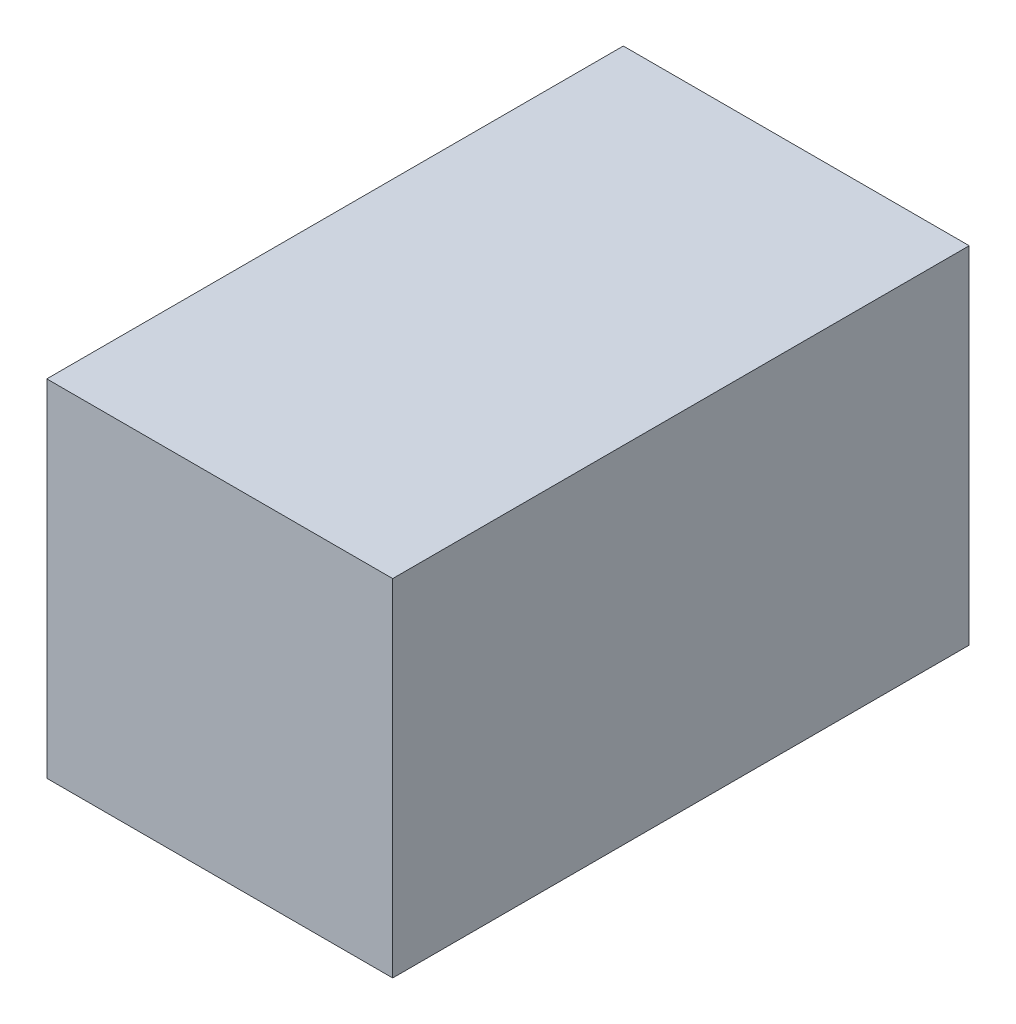
ISO-10303-21;
HEADER;
FILE_DESCRIPTION(('STEP AP214'),'2;1');
FILE_NAME('part.step','',(''),(''),'','','');
FILE_SCHEMA(('AUTOMOTIVE_DESIGN { 1 0 10303 214 1 1 1 1 }'));
ENDSEC;
DATA;
#1=APPLICATION_CONTEXT('core data for automotive mechanical design processes');
#2=APPLICATION_PROTOCOL_DEFINITION('international standard','automotive_design',2000,#1);
#3=PRODUCT_CONTEXT('',#1,'mechanical');
#4=PRODUCT('Part','Part','',(#3));
#5=PRODUCT_RELATED_PRODUCT_CATEGORY('part','',(#4));
#6=PRODUCT_DEFINITION_FORMATION('','',#4);
#7=PRODUCT_DEFINITION_CONTEXT('part definition',#1,'design');
#8=PRODUCT_DEFINITION('design','',#6,#7);
#9=PRODUCT_DEFINITION_SHAPE('','',#8);
#10=(LENGTH_UNIT() NAMED_UNIT(*) SI_UNIT(.MILLI.,.METRE.));
#11=(NAMED_UNIT(*) PLANE_ANGLE_UNIT() SI_UNIT($,.RADIAN.));
#12=(NAMED_UNIT(*) SI_UNIT($,.STERADIAN.) SOLID_ANGLE_UNIT());
#13=UNCERTAINTY_MEASURE_WITH_UNIT(LENGTH_MEASURE(1.E-05),#10,'distance_accuracy_value','');
#14=(GEOMETRIC_REPRESENTATION_CONTEXT(3) GLOBAL_UNCERTAINTY_ASSIGNED_CONTEXT((#13)) GLOBAL_UNIT_ASSIGNED_CONTEXT((#10,
#11,#12)) REPRESENTATION_CONTEXT('',''));
#15=CARTESIAN_POINT('',(0.,0.,0.));
#16=DIRECTION('',(0.,0.,1.));
#17=DIRECTION('',(1.,0.,0.));
#18=AXIS2_PLACEMENT_3D('',#15,#16,#17);
#19=CARTESIAN_POINT('',(-15.,-15.,-50.));
#20=DIRECTION('',(-1.,0.,0.));
#21=DIRECTION('',(0.,0.,1.));
#22=AXIS2_PLACEMENT_3D('',#19,#20,#21);
#23=PLANE('',#22);
#24=DIRECTION('',(0.,-1.,0.));
#25=VECTOR('',#24,1.);
#26=CARTESIAN_POINT('',(-15.,-15.,0.));
#27=LINE('',#26,#25);
#28=CARTESIAN_POINT('',(-15.,15.,0.));
#29=VERTEX_POINT('',#28);
#30=CARTESIAN_POINT('',(-15.,-15.,0.));
#31=VERTEX_POINT('',#30);
#32=EDGE_CURVE('E113',#29,#31,#27,.T.);
#33=ORIENTED_EDGE('',*,*,#32,.F.);
#34=DIRECTION('',(0.,0.,1.));
#35=VECTOR('',#34,1.);
#36=CARTESIAN_POINT('',(-15.,15.,-50.));
#37=LINE('',#36,#35);
#38=CARTESIAN_POINT('',(-15.,15.,-50.));
#39=VERTEX_POINT('',#38);
#40=EDGE_CURVE('E11',#39,#29,#37,.T.);
#41=ORIENTED_EDGE('',*,*,#40,.F.);
#42=DIRECTION('',(0.,-1.,0.));
#43=VECTOR('',#42,1.);
#44=CARTESIAN_POINT('',(-15.,-15.,-50.));
#45=LINE('',#44,#43);
#46=CARTESIAN_POINT('',(-15.,-15.,-50.));
#47=VERTEX_POINT('',#46);
#48=EDGE_CURVE('E107',#39,#47,#45,.T.);
#49=ORIENTED_EDGE('',*,*,#48,.T.);
#50=DIRECTION('',(0.,0.,1.));
#51=VECTOR('',#50,1.);
#52=CARTESIAN_POINT('',(-15.,-15.,-50.));
#53=LINE('',#52,#51);
#54=EDGE_CURVE('E48',#47,#31,#53,.T.);
#55=ORIENTED_EDGE('',*,*,#54,.T.);
#56=EDGE_LOOP('',(#33,#41,#49,#55));
#57=FACE_BOUND('',#56,.T.);
#58=ADVANCED_FACE('F44',(#57),#23,.T.);
#59=CARTESIAN_POINT('',(15.,15.,-50.));
#60=DIRECTION('',(0.,1.,0.));
#61=DIRECTION('',(-1.,0.,0.));
#62=AXIS2_PLACEMENT_3D('',#59,#60,#61);
#63=PLANE('',#62);
#64=DIRECTION('',(-1.,0.,0.));
#65=VECTOR('',#64,1.);
#66=CARTESIAN_POINT('',(15.,15.,0.));
#67=LINE('',#66,#65);
#68=CARTESIAN_POINT('',(15.,15.,0.));
#69=VERTEX_POINT('',#68);
#70=EDGE_CURVE('E110',#69,#29,#67,.T.);
#71=ORIENTED_EDGE('',*,*,#70,.F.);
#72=DIRECTION('',(0.,0.,1.));
#73=VECTOR('',#72,1.);
#74=CARTESIAN_POINT('',(15.,15.,-50.));
#75=LINE('',#74,#73);
#76=CARTESIAN_POINT('',(15.,15.,-50.));
#77=VERTEX_POINT('',#76);
#78=EDGE_CURVE('E54',#77,#69,#75,.T.);
#79=ORIENTED_EDGE('',*,*,#78,.F.);
#80=DIRECTION('',(-1.,0.,0.));
#81=VECTOR('',#80,1.);
#82=CARTESIAN_POINT('',(15.,15.,-50.));
#83=LINE('',#82,#81);
#84=EDGE_CURVE('E105',#77,#39,#83,.T.);
#85=ORIENTED_EDGE('',*,*,#84,.T.);
#86=ORIENTED_EDGE('',*,*,#40,.T.);
#87=EDGE_LOOP('',(#71,#79,#85,#86));
#88=FACE_BOUND('',#87,.T.);
#89=ADVANCED_FACE('F131',(#88),#63,.T.);
#90=CARTESIAN_POINT('',(15.,-15.,-50.));
#91=DIRECTION('',(1.,0.,0.));
#92=DIRECTION('',(0.,0.,-1.));
#93=AXIS2_PLACEMENT_3D('',#90,#91,#92);
#94=PLANE('',#93);
#95=DIRECTION('',(0.,1.,0.));
#96=VECTOR('',#95,1.);
#97=CARTESIAN_POINT('',(15.,-15.,0.));
#98=LINE('',#97,#96);
#99=CARTESIAN_POINT('',(15.,-15.,0.));
#100=VERTEX_POINT('',#99);
#101=EDGE_CURVE('E96',#100,#69,#98,.T.);
#102=ORIENTED_EDGE('',*,*,#101,.F.);
#103=DIRECTION('',(0.,0.,1.));
#104=VECTOR('',#103,1.);
#105=CARTESIAN_POINT('',(15.,-15.,-50.));
#106=LINE('',#105,#104);
#107=CARTESIAN_POINT('',(15.,-15.,-50.));
#108=VERTEX_POINT('',#107);
#109=EDGE_CURVE('E91',#108,#100,#106,.T.);
#110=ORIENTED_EDGE('',*,*,#109,.F.);
#111=DIRECTION('',(0.,1.,0.));
#112=VECTOR('',#111,1.);
#113=CARTESIAN_POINT('',(15.,-15.,-50.));
#114=LINE('',#113,#112);
#115=EDGE_CURVE('E92',#108,#77,#114,.T.);
#116=ORIENTED_EDGE('',*,*,#115,.T.);
#117=ORIENTED_EDGE('',*,*,#78,.T.);
#118=EDGE_LOOP('',(#102,#110,#116,#117));
#119=FACE_BOUND('',#118,.T.);
#120=ADVANCED_FACE('F93',(#119),#94,.T.);
#121=CARTESIAN_POINT('',(15.,-15.,-50.));
#122=DIRECTION('',(0.,-1.,0.));
#123=DIRECTION('',(1.,0.,0.));
#124=AXIS2_PLACEMENT_3D('',#121,#122,#123);
#125=PLANE('',#124);
#126=DIRECTION('',(1.,0.,0.));
#127=VECTOR('',#126,1.);
#128=CARTESIAN_POINT('',(15.,-15.,0.));
#129=LINE('',#128,#127);
#130=EDGE_CURVE('E118',#31,#100,#129,.T.);
#131=ORIENTED_EDGE('',*,*,#130,.F.);
#132=ORIENTED_EDGE('',*,*,#54,.F.);
#133=DIRECTION('',(1.,0.,0.));
#134=VECTOR('',#133,1.);
#135=CARTESIAN_POINT('',(15.,-15.,-50.));
#136=LINE('',#135,#134);
#137=EDGE_CURVE('E102',#47,#108,#136,.T.);
#138=ORIENTED_EDGE('',*,*,#137,.T.);
#139=ORIENTED_EDGE('',*,*,#109,.T.);
#140=EDGE_LOOP('',(#131,#132,#138,#139));
#141=FACE_BOUND('',#140,.T.);
#142=ADVANCED_FACE('F103',(#141),#125,.T.);
#143=CARTESIAN_POINT('',(0.,0.,-50.));
#144=DIRECTION('',(0.,0.,1.));
#145=DIRECTION('',(1.,0.,0.));
#146=AXIS2_PLACEMENT_3D('',#143,#144,#145);
#147=PLANE('',#146);
#148=ORIENTED_EDGE('',*,*,#48,.F.);
#149=ORIENTED_EDGE('',*,*,#84,.F.);
#150=ORIENTED_EDGE('',*,*,#115,.F.);
#151=ORIENTED_EDGE('',*,*,#137,.F.);
#152=EDGE_LOOP('',(#148,#149,#150,#151));
#153=FACE_BOUND('',#152,.T.);
#154=ADVANCED_FACE('F99',(#153),#147,.F.);
#155=CARTESIAN_POINT('',(0.,0.,0.));
#156=DIRECTION('',(0.,0.,1.));
#157=DIRECTION('',(1.,0.,0.));
#158=AXIS2_PLACEMENT_3D('',#155,#156,#157);
#159=PLANE('',#158);
#160=ORIENTED_EDGE('',*,*,#32,.T.);
#161=ORIENTED_EDGE('',*,*,#130,.T.);
#162=ORIENTED_EDGE('',*,*,#101,.T.);
#163=ORIENTED_EDGE('',*,*,#70,.T.);
#164=EDGE_LOOP('',(#160,#161,#162,#163));
#165=FACE_BOUND('',#164,.T.);
#166=ADVANCED_FACE('F127',(#165),#159,.T.);
#167=CLOSED_SHELL('',(#58,#89,#120,#142,#154,#166));
#168=MANIFOLD_SOLID_BREP('B2',#167);
#169=ADVANCED_BREP_SHAPE_REPRESENTATION('',(#18,#168),#14);
#170=SHAPE_DEFINITION_REPRESENTATION(#9,#169);
ENDSEC;
END-ISO-10303-21;
